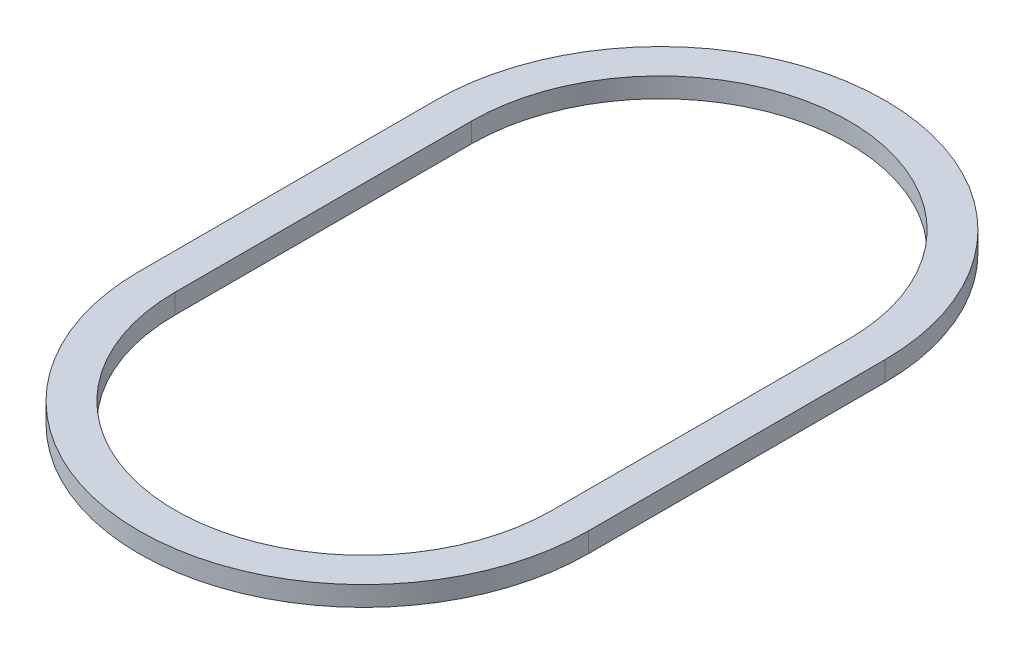
ISO-10303-21;
HEADER;
FILE_DESCRIPTION(('STEP AP214'),'2;1');
FILE_NAME('part.step','',(''),(''),'','','');
FILE_SCHEMA(('AUTOMOTIVE_DESIGN { 1 0 10303 214 1 1 1 1 }'));
ENDSEC;
DATA;
#1=APPLICATION_CONTEXT('core data for automotive mechanical design processes');
#2=APPLICATION_PROTOCOL_DEFINITION('international standard','automotive_design',2000,#1);
#3=PRODUCT_CONTEXT('',#1,'mechanical');
#4=PRODUCT('Part','Part','',(#3));
#5=PRODUCT_RELATED_PRODUCT_CATEGORY('part','',(#4));
#6=PRODUCT_DEFINITION_FORMATION('','',#4);
#7=PRODUCT_DEFINITION_CONTEXT('part definition',#1,'design');
#8=PRODUCT_DEFINITION('design','',#6,#7);
#9=PRODUCT_DEFINITION_SHAPE('','',#8);
#10=(LENGTH_UNIT() NAMED_UNIT(*) SI_UNIT(.MILLI.,.METRE.));
#11=(NAMED_UNIT(*) PLANE_ANGLE_UNIT() SI_UNIT($,.RADIAN.));
#12=(NAMED_UNIT(*) SI_UNIT($,.STERADIAN.) SOLID_ANGLE_UNIT());
#13=UNCERTAINTY_MEASURE_WITH_UNIT(LENGTH_MEASURE(1.E-05),#10,'distance_accuracy_value','');
#14=(GEOMETRIC_REPRESENTATION_CONTEXT(3) GLOBAL_UNCERTAINTY_ASSIGNED_CONTEXT((#13)) GLOBAL_UNIT_ASSIGNED_CONTEXT((#10,
#11,#12)) REPRESENTATION_CONTEXT('',''));
#15=CARTESIAN_POINT('',(0.,0.,0.));
#16=DIRECTION('',(0.,0.,1.));
#17=DIRECTION('',(1.,0.,0.));
#18=AXIS2_PLACEMENT_3D('',#15,#16,#17);
#19=CARTESIAN_POINT('',(0.,2.2,0.));
#20=DIRECTION('',(0.,1.,0.));
#21=DIRECTION('',(0.,0.,1.));
#22=AXIS2_PLACEMENT_3D('',#19,#20,#21);
#23=PLANE('',#22);
#24=CARTESIAN_POINT('',(0.,2.2,0.));
#25=DIRECTION('',(0.,1.,0.));
#26=DIRECTION('',(0.,0.,1.));
#27=AXIS2_PLACEMENT_3D('',#24,#25,#26);
#28=CIRCLE('',#27,25.);
#29=CARTESIAN_POINT('',(25.,2.2,0.));
#30=VERTEX_POINT('',#29);
#31=CARTESIAN_POINT('',(-25.,2.2,0.));
#32=VERTEX_POINT('',#31);
#33=EDGE_CURVE('E153',#30,#32,#28,.T.);
#34=ORIENTED_EDGE('',*,*,#33,.T.);
#35=DIRECTION('',(0.,0.,1.));
#36=VECTOR('',#35,1.);
#37=CARTESIAN_POINT('',(-25.,2.2,0.));
#38=LINE('',#37,#36);
#39=CARTESIAN_POINT('',(-25.,2.2,33.));
#40=VERTEX_POINT('',#39);
#41=EDGE_CURVE('E157',#32,#40,#38,.T.);
#42=ORIENTED_EDGE('',*,*,#41,.T.);
#43=CARTESIAN_POINT('',(0.,2.2,33.));
#44=DIRECTION('',(0.,1.,0.));
#45=DIRECTION('',(0.,0.,1.));
#46=AXIS2_PLACEMENT_3D('',#43,#44,#45);
#47=CIRCLE('',#46,25.);
#48=CARTESIAN_POINT('',(25.,2.2,33.));
#49=VERTEX_POINT('',#48);
#50=EDGE_CURVE('E161',#40,#49,#47,.T.);
#51=ORIENTED_EDGE('',*,*,#50,.T.);
#52=DIRECTION('',(0.,0.,-1.));
#53=VECTOR('',#52,1.);
#54=CARTESIAN_POINT('',(25.,2.2,0.));
#55=LINE('',#54,#53);
#56=EDGE_CURVE('E164',#49,#30,#55,.T.);
#57=ORIENTED_EDGE('',*,*,#56,.T.);
#58=EDGE_LOOP('',(#34,#42,#51,#57));
#59=FACE_BOUND('',#58,.T.);
#60=DIRECTION('',(0.,0.,-1.));
#61=VECTOR('',#60,1.);
#62=CARTESIAN_POINT('',(21.,2.2,33.));
#63=LINE('',#62,#61);
#64=CARTESIAN_POINT('',(21.,2.2,33.));
#65=VERTEX_POINT('',#64);
#66=CARTESIAN_POINT('',(21.,2.2,0.));
#67=VERTEX_POINT('',#66);
#68=EDGE_CURVE('E114',#65,#67,#63,.T.);
#69=ORIENTED_EDGE('',*,*,#68,.F.);
#70=CARTESIAN_POINT('',(0.,2.2,33.));
#71=DIRECTION('',(0.,1.,0.));
#72=DIRECTION('',(0.,0.,1.));
#73=AXIS2_PLACEMENT_3D('',#70,#71,#72);
#74=CIRCLE('',#73,21.);
#75=CARTESIAN_POINT('',(-21.,2.2,33.));
#76=VERTEX_POINT('',#75);
#77=EDGE_CURVE('E105',#76,#65,#74,.T.);
#78=ORIENTED_EDGE('',*,*,#77,.F.);
#79=DIRECTION('',(0.,0.,1.));
#80=VECTOR('',#79,1.);
#81=CARTESIAN_POINT('',(-21.,2.2,33.));
#82=LINE('',#81,#80);
#83=CARTESIAN_POINT('',(-21.,2.2,0.));
#84=VERTEX_POINT('',#83);
#85=EDGE_CURVE('E131',#84,#76,#82,.T.);
#86=ORIENTED_EDGE('',*,*,#85,.F.);
#87=CARTESIAN_POINT('',(0.,2.2,0.));
#88=DIRECTION('',(0.,1.,0.));
#89=DIRECTION('',(0.,0.,1.));
#90=AXIS2_PLACEMENT_3D('',#87,#88,#89);
#91=CIRCLE('',#90,21.);
#92=EDGE_CURVE('E127',#67,#84,#91,.T.);
#93=ORIENTED_EDGE('',*,*,#92,.F.);
#94=EDGE_LOOP('',(#69,#78,#86,#93));
#95=FACE_BOUND('',#94,.T.);
#96=ADVANCED_FACE('F39',(#59,#95),#23,.T.);
#97=CARTESIAN_POINT('',(0.,0.,0.));
#98=DIRECTION('',(0.,1.,0.));
#99=DIRECTION('',(0.,0.,1.));
#100=AXIS2_PLACEMENT_3D('',#97,#98,#99);
#101=PLANE('',#100);
#102=CARTESIAN_POINT('',(0.,0.,0.));
#103=DIRECTION('',(0.,1.,0.));
#104=DIRECTION('',(0.,0.,1.));
#105=AXIS2_PLACEMENT_3D('',#102,#103,#104);
#106=CIRCLE('',#105,25.);
#107=CARTESIAN_POINT('',(25.,0.,0.));
#108=VERTEX_POINT('',#107);
#109=CARTESIAN_POINT('',(-25.,0.,0.));
#110=VERTEX_POINT('',#109);
#111=EDGE_CURVE('E123',#108,#110,#106,.T.);
#112=ORIENTED_EDGE('',*,*,#111,.F.);
#113=DIRECTION('',(0.,0.,-1.));
#114=VECTOR('',#113,1.);
#115=CARTESIAN_POINT('',(25.,0.,0.));
#116=LINE('',#115,#114);
#117=CARTESIAN_POINT('',(25.,0.,33.));
#118=VERTEX_POINT('',#117);
#119=EDGE_CURVE('E158',#118,#108,#116,.T.);
#120=ORIENTED_EDGE('',*,*,#119,.F.);
#121=CARTESIAN_POINT('',(0.,0.,33.));
#122=DIRECTION('',(0.,1.,0.));
#123=DIRECTION('',(0.,0.,1.));
#124=AXIS2_PLACEMENT_3D('',#121,#122,#123);
#125=CIRCLE('',#124,25.);
#126=CARTESIAN_POINT('',(-25.,0.,33.));
#127=VERTEX_POINT('',#126);
#128=EDGE_CURVE('E174',#127,#118,#125,.T.);
#129=ORIENTED_EDGE('',*,*,#128,.F.);
#130=DIRECTION('',(0.,0.,1.));
#131=VECTOR('',#130,1.);
#132=CARTESIAN_POINT('',(-25.,0.,0.));
#133=LINE('',#132,#131);
#134=EDGE_CURVE('E171',#110,#127,#133,.T.);
#135=ORIENTED_EDGE('',*,*,#134,.F.);
#136=EDGE_LOOP('',(#112,#120,#129,#135));
#137=FACE_BOUND('',#136,.T.);
#138=CARTESIAN_POINT('',(0.,0.,33.));
#139=DIRECTION('',(0.,1.,0.));
#140=DIRECTION('',(0.,0.,1.));
#141=AXIS2_PLACEMENT_3D('',#138,#139,#140);
#142=CIRCLE('',#141,21.);
#143=CARTESIAN_POINT('',(-21.,0.,33.));
#144=VERTEX_POINT('',#143);
#145=CARTESIAN_POINT('',(21.,0.,33.));
#146=VERTEX_POINT('',#145);
#147=EDGE_CURVE('E63',#144,#146,#142,.T.);
#148=ORIENTED_EDGE('',*,*,#147,.T.);
#149=DIRECTION('',(0.,0.,-1.));
#150=VECTOR('',#149,1.);
#151=CARTESIAN_POINT('',(21.,0.,33.));
#152=LINE('',#151,#150);
#153=CARTESIAN_POINT('',(21.,0.,0.));
#154=VERTEX_POINT('',#153);
#155=EDGE_CURVE('E121',#146,#154,#152,.T.);
#156=ORIENTED_EDGE('',*,*,#155,.T.);
#157=CARTESIAN_POINT('',(0.,0.,0.));
#158=DIRECTION('',(0.,1.,0.));
#159=DIRECTION('',(0.,0.,1.));
#160=AXIS2_PLACEMENT_3D('',#157,#158,#159);
#161=CIRCLE('',#160,21.);
#162=CARTESIAN_POINT('',(-21.,0.,0.));
#163=VERTEX_POINT('',#162);
#164=EDGE_CURVE('E140',#154,#163,#161,.T.);
#165=ORIENTED_EDGE('',*,*,#164,.T.);
#166=DIRECTION('',(0.,0.,1.));
#167=VECTOR('',#166,1.);
#168=CARTESIAN_POINT('',(-21.,0.,33.));
#169=LINE('',#168,#167);
#170=EDGE_CURVE('E115',#163,#144,#169,.T.);
#171=ORIENTED_EDGE('',*,*,#170,.T.);
#172=EDGE_LOOP('',(#148,#156,#165,#171));
#173=FACE_BOUND('',#172,.T.);
#174=ADVANCED_FACE('F197',(#137,#173),#101,.F.);
#175=CARTESIAN_POINT('',(0.,2.2,0.));
#176=DIRECTION('',(0.,-1.,0.));
#177=DIRECTION('',(0.,0.,-1.));
#178=AXIS2_PLACEMENT_3D('',#175,#176,#177);
#179=CYLINDRICAL_SURFACE('',#178,25.);
#180=ORIENTED_EDGE('',*,*,#111,.T.);
#181=DIRECTION('',(0.,-1.,0.));
#182=VECTOR('',#181,1.);
#183=CARTESIAN_POINT('',(-25.,2.2,0.));
#184=LINE('',#183,#182);
#185=EDGE_CURVE('E11',#32,#110,#184,.T.);
#186=ORIENTED_EDGE('',*,*,#185,.F.);
#187=ORIENTED_EDGE('',*,*,#33,.F.);
#188=DIRECTION('',(0.,-1.,0.));
#189=VECTOR('',#188,1.);
#190=CARTESIAN_POINT('',(25.,2.2,0.));
#191=LINE('',#190,#189);
#192=EDGE_CURVE('E167',#30,#108,#191,.T.);
#193=ORIENTED_EDGE('',*,*,#192,.T.);
#194=EDGE_LOOP('',(#180,#186,#187,#193));
#195=FACE_BOUND('',#194,.T.);
#196=ADVANCED_FACE('F41',(#195),#179,.T.);
#197=CARTESIAN_POINT('',(-25.,2.2,0.));
#198=DIRECTION('',(1.,0.,0.));
#199=DIRECTION('',(0.,0.,-1.));
#200=AXIS2_PLACEMENT_3D('',#197,#198,#199);
#201=PLANE('',#200);
#202=ORIENTED_EDGE('',*,*,#134,.T.);
#203=DIRECTION('',(0.,-1.,0.));
#204=VECTOR('',#203,1.);
#205=CARTESIAN_POINT('',(-25.,2.2,33.));
#206=LINE('',#205,#204);
#207=EDGE_CURVE('E48',#40,#127,#206,.T.);
#208=ORIENTED_EDGE('',*,*,#207,.F.);
#209=ORIENTED_EDGE('',*,*,#41,.F.);
#210=ORIENTED_EDGE('',*,*,#185,.T.);
#211=EDGE_LOOP('',(#202,#208,#209,#210));
#212=FACE_BOUND('',#211,.T.);
#213=ADVANCED_FACE('F207',(#212),#201,.F.);
#214=CARTESIAN_POINT('',(0.,2.2,33.));
#215=DIRECTION('',(0.,-1.,0.));
#216=DIRECTION('',(0.,0.,-1.));
#217=AXIS2_PLACEMENT_3D('',#214,#215,#216);
#218=CYLINDRICAL_SURFACE('',#217,25.);
#219=ORIENTED_EDGE('',*,*,#128,.T.);
#220=DIRECTION('',(0.,-1.,0.));
#221=VECTOR('',#220,1.);
#222=CARTESIAN_POINT('',(25.,2.2,33.));
#223=LINE('',#222,#221);
#224=EDGE_CURVE('E182',#49,#118,#223,.T.);
#225=ORIENTED_EDGE('',*,*,#224,.F.);
#226=ORIENTED_EDGE('',*,*,#50,.F.);
#227=ORIENTED_EDGE('',*,*,#207,.T.);
#228=EDGE_LOOP('',(#219,#225,#226,#227));
#229=FACE_BOUND('',#228,.T.);
#230=ADVANCED_FACE('F191',(#229),#218,.T.);
#231=CARTESIAN_POINT('',(25.,2.2,0.));
#232=DIRECTION('',(-1.,0.,0.));
#233=DIRECTION('',(0.,0.,1.));
#234=AXIS2_PLACEMENT_3D('',#231,#232,#233);
#235=PLANE('',#234);
#236=ORIENTED_EDGE('',*,*,#119,.T.);
#237=ORIENTED_EDGE('',*,*,#192,.F.);
#238=ORIENTED_EDGE('',*,*,#56,.F.);
#239=ORIENTED_EDGE('',*,*,#224,.T.);
#240=EDGE_LOOP('',(#236,#237,#238,#239));
#241=FACE_BOUND('',#240,.T.);
#242=ADVANCED_FACE('F201',(#241),#235,.F.);
#243=CARTESIAN_POINT('',(0.,2.2,33.));
#244=DIRECTION('',(0.,-1.,0.));
#245=DIRECTION('',(0.,0.,-1.));
#246=AXIS2_PLACEMENT_3D('',#243,#244,#245);
#247=CYLINDRICAL_SURFACE('',#246,21.);
#248=ORIENTED_EDGE('',*,*,#147,.F.);
#249=DIRECTION('',(0.,-1.,0.));
#250=VECTOR('',#249,1.);
#251=CARTESIAN_POINT('',(-21.,2.2,33.));
#252=LINE('',#251,#250);
#253=EDGE_CURVE('E109',#76,#144,#252,.T.);
#254=ORIENTED_EDGE('',*,*,#253,.F.);
#255=ORIENTED_EDGE('',*,*,#77,.T.);
#256=DIRECTION('',(0.,-1.,0.));
#257=VECTOR('',#256,1.);
#258=CARTESIAN_POINT('',(21.,2.2,33.));
#259=LINE('',#258,#257);
#260=EDGE_CURVE('E108',#65,#146,#259,.T.);
#261=ORIENTED_EDGE('',*,*,#260,.T.);
#262=EDGE_LOOP('',(#248,#254,#255,#261));
#263=FACE_BOUND('',#262,.T.);
#264=ADVANCED_FACE('F107',(#263),#247,.F.);
#265=CARTESIAN_POINT('',(21.,2.2,33.));
#266=DIRECTION('',(-1.,0.,0.));
#267=DIRECTION('',(0.,0.,1.));
#268=AXIS2_PLACEMENT_3D('',#265,#266,#267);
#269=PLANE('',#268);
#270=ORIENTED_EDGE('',*,*,#155,.F.);
#271=ORIENTED_EDGE('',*,*,#260,.F.);
#272=ORIENTED_EDGE('',*,*,#68,.T.);
#273=DIRECTION('',(0.,-1.,0.));
#274=VECTOR('',#273,1.);
#275=CARTESIAN_POINT('',(21.,2.2,0.));
#276=LINE('',#275,#274);
#277=EDGE_CURVE('E124',#67,#154,#276,.T.);
#278=ORIENTED_EDGE('',*,*,#277,.T.);
#279=EDGE_LOOP('',(#270,#271,#272,#278));
#280=FACE_BOUND('',#279,.T.);
#281=ADVANCED_FACE('F118',(#280),#269,.T.);
#282=CARTESIAN_POINT('',(0.,2.2,0.));
#283=DIRECTION('',(0.,-1.,0.));
#284=DIRECTION('',(0.,0.,-1.));
#285=AXIS2_PLACEMENT_3D('',#282,#283,#284);
#286=CYLINDRICAL_SURFACE('',#285,21.);
#287=ORIENTED_EDGE('',*,*,#164,.F.);
#288=ORIENTED_EDGE('',*,*,#277,.F.);
#289=ORIENTED_EDGE('',*,*,#92,.T.);
#290=DIRECTION('',(0.,-1.,0.));
#291=VECTOR('',#290,1.);
#292=CARTESIAN_POINT('',(-21.,2.2,0.));
#293=LINE('',#292,#291);
#294=EDGE_CURVE('E55',#84,#163,#293,.T.);
#295=ORIENTED_EDGE('',*,*,#294,.T.);
#296=EDGE_LOOP('',(#287,#288,#289,#295));
#297=FACE_BOUND('',#296,.T.);
#298=ADVANCED_FACE('F230',(#297),#286,.F.);
#299=CARTESIAN_POINT('',(-21.,2.2,33.));
#300=DIRECTION('',(1.,0.,0.));
#301=DIRECTION('',(0.,0.,-1.));
#302=AXIS2_PLACEMENT_3D('',#299,#300,#301);
#303=PLANE('',#302);
#304=ORIENTED_EDGE('',*,*,#170,.F.);
#305=ORIENTED_EDGE('',*,*,#294,.F.);
#306=ORIENTED_EDGE('',*,*,#85,.T.);
#307=ORIENTED_EDGE('',*,*,#253,.T.);
#308=EDGE_LOOP('',(#304,#305,#306,#307));
#309=FACE_BOUND('',#308,.T.);
#310=ADVANCED_FACE('F234',(#309),#303,.T.);
#311=CLOSED_SHELL('',(#96,#174,#196,#213,#230,#242,#264,#281,#298,#310));
#312=MANIFOLD_SOLID_BREP('B2',#311);
#313=ADVANCED_BREP_SHAPE_REPRESENTATION('',(#18,#312),#14);
#314=SHAPE_DEFINITION_REPRESENTATION(#9,#313);
ENDSEC;
END-ISO-10303-21;
